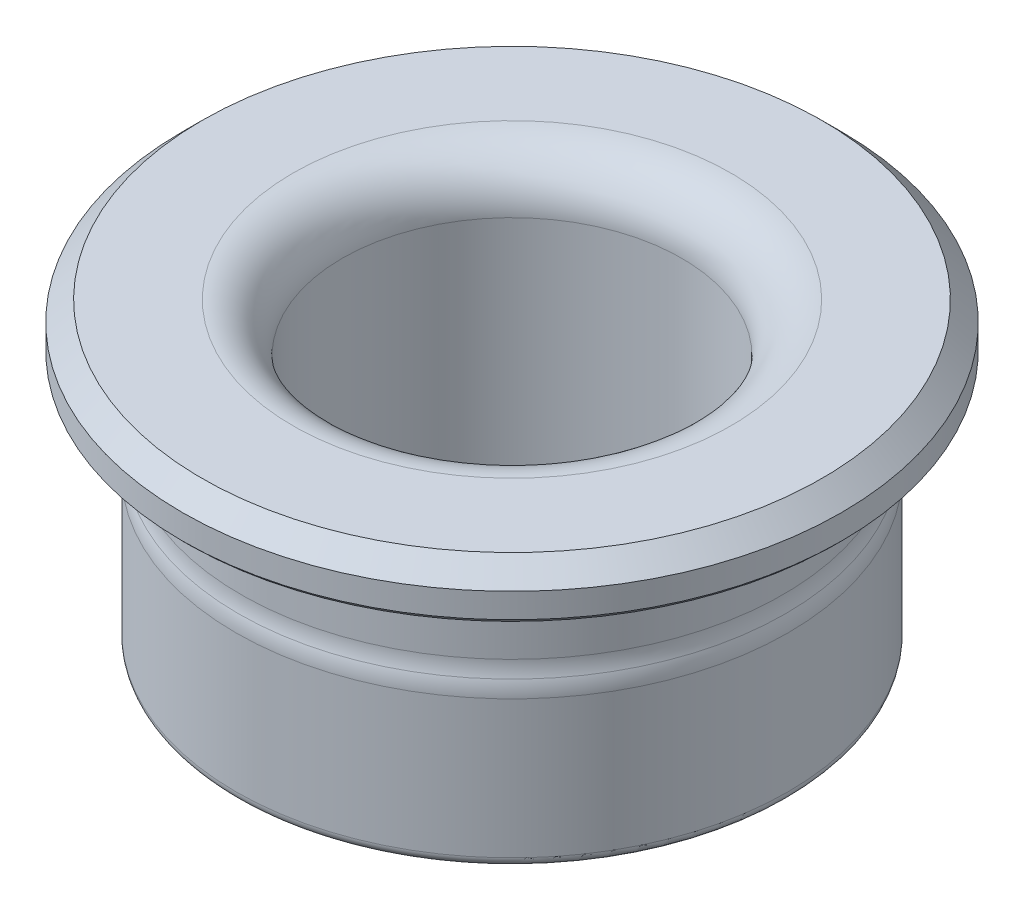
ISO-10303-21;
HEADER;
FILE_DESCRIPTION(('STEP AP214'),'2;1');
FILE_NAME('part.step','',(''),(''),'','','');
FILE_SCHEMA(('AUTOMOTIVE_DESIGN { 1 0 10303 214 1 1 1 1 }'));
ENDSEC;
DATA;
#1=APPLICATION_CONTEXT('core data for automotive mechanical design processes');
#2=APPLICATION_PROTOCOL_DEFINITION('international standard','automotive_design',2000,#1);
#3=PRODUCT_CONTEXT('',#1,'mechanical');
#4=PRODUCT('Part','Part','',(#3));
#5=PRODUCT_RELATED_PRODUCT_CATEGORY('part','',(#4));
#6=PRODUCT_DEFINITION_FORMATION('','',#4);
#7=PRODUCT_DEFINITION_CONTEXT('part definition',#1,'design');
#8=PRODUCT_DEFINITION('design','',#6,#7);
#9=PRODUCT_DEFINITION_SHAPE('','',#8);
#10=(LENGTH_UNIT() NAMED_UNIT(*) SI_UNIT(.MILLI.,.METRE.));
#11=(NAMED_UNIT(*) PLANE_ANGLE_UNIT() SI_UNIT($,.RADIAN.));
#12=(NAMED_UNIT(*) SI_UNIT($,.STERADIAN.) SOLID_ANGLE_UNIT());
#13=UNCERTAINTY_MEASURE_WITH_UNIT(LENGTH_MEASURE(1.E-05),#10,'distance_accuracy_value','');
#14=(GEOMETRIC_REPRESENTATION_CONTEXT(3) GLOBAL_UNCERTAINTY_ASSIGNED_CONTEXT((#13)) GLOBAL_UNIT_ASSIGNED_CONTEXT((#10,
#11,#12)) REPRESENTATION_CONTEXT('',''));
#15=CARTESIAN_POINT('',(0.,0.,0.));
#16=DIRECTION('',(0.,0.,1.));
#17=DIRECTION('',(1.,0.,0.));
#18=AXIS2_PLACEMENT_3D('',#15,#16,#17);
#19=CARTESIAN_POINT('',(0.,0.,0.));
#20=DIRECTION('',(0.,1.,0.));
#21=DIRECTION('',(-1.,0.,0.));
#22=AXIS2_PLACEMENT_3D('',#19,#20,#21);
#23=PLANE('',#22);
#24=CARTESIAN_POINT('',(0.,0.,0.));
#25=DIRECTION('',(0.,1.,0.));
#26=DIRECTION('',(-1.,0.,0.));
#27=AXIS2_PLACEMENT_3D('',#24,#25,#26);
#28=CIRCLE('',#27,5.41);
#29=CARTESIAN_POINT('',(-5.41,0.,0.));
#30=VERTEX_POINT('',#29);
#31=EDGE_CURVE('E116',#30,#30,#28,.T.);
#32=ORIENTED_EDGE('',*,*,#31,.F.);
#33=EDGE_LOOP('',(#32));
#34=FACE_BOUND('',#33,.T.);
#35=CARTESIAN_POINT('',(0.,0.,0.));
#36=DIRECTION('',(0.,1.,0.));
#37=DIRECTION('',(-1.,0.,0.));
#38=AXIS2_PLACEMENT_3D('',#35,#36,#37);
#39=CIRCLE('',#38,3.65);
#40=CARTESIAN_POINT('',(-3.65,0.,0.));
#41=VERTEX_POINT('',#40);
#42=EDGE_CURVE('E10',#41,#41,#39,.T.);
#43=ORIENTED_EDGE('',*,*,#42,.T.);
#44=EDGE_LOOP('',(#43));
#45=FACE_BOUND('',#44,.T.);
#46=ADVANCED_FACE('F51',(#34,#45),#23,.F.);
#47=CARTESIAN_POINT('',(0.,0.2,0.));
#48=DIRECTION('',(0.,1.,0.));
#49=DIRECTION('',(-1.,0.,0.));
#50=AXIS2_PLACEMENT_3D('',#47,#48,#49);
#51=TOROIDAL_SURFACE('',#50,3.65,0.2);
#52=CARTESIAN_POINT('',(0.,0.200000000000001,0.));
#53=DIRECTION('',(0.,1.,0.));
#54=DIRECTION('',(-1.,0.,0.));
#55=AXIS2_PLACEMENT_3D('',#52,#53,#54);
#56=CIRCLE('',#55,3.45);
#57=CARTESIAN_POINT('',(-3.45,0.2,0.));
#58=VERTEX_POINT('',#57);
#59=EDGE_CURVE('E58',#58,#58,#56,.T.);
#60=ORIENTED_EDGE('',*,*,#59,.T.);
#61=EDGE_LOOP('',(#60));
#62=FACE_BOUND('',#61,.T.);
#63=ORIENTED_EDGE('',*,*,#42,.F.);
#64=EDGE_LOOP('',(#63));
#65=FACE_BOUND('',#64,.T.);
#66=ADVANCED_FACE('F125',(#62,#65),#51,.T.);
#67=CARTESIAN_POINT('',(0.,11.984375,0.));
#68=DIRECTION('',(0.,1.,0.));
#69=DIRECTION('',(-1.,0.,0.));
#70=AXIS2_PLACEMENT_3D('',#67,#68,#69);
#71=CYLINDRICAL_SURFACE('',#70,3.45);
#72=CARTESIAN_POINT('',(0.,5.060607,0.));
#73=DIRECTION('',(0.,1.,0.));
#74=DIRECTION('',(-1.,0.,0.));
#75=AXIS2_PLACEMENT_3D('',#72,#73,#74);
#76=CIRCLE('',#75,3.45);
#77=CARTESIAN_POINT('',(-3.45,5.060607,0.));
#78=VERTEX_POINT('',#77);
#79=EDGE_CURVE('E64',#78,#78,#76,.T.);
#80=ORIENTED_EDGE('',*,*,#79,.T.);
#81=EDGE_LOOP('',(#80));
#82=FACE_BOUND('',#81,.T.);
#83=ORIENTED_EDGE('',*,*,#59,.F.);
#84=EDGE_LOOP('',(#83));
#85=FACE_BOUND('',#84,.T.);
#86=ADVANCED_FACE('F128',(#82,#85),#71,.F.);
#87=CARTESIAN_POINT('',(0.,5.060607,0.));
#88=DIRECTION('',(0.,1.,0.));
#89=DIRECTION('',(-1.,0.,0.));
#90=AXIS2_PLACEMENT_3D('',#87,#88,#89);
#91=TOROIDAL_SURFACE('',#90,4.45,1.);
#92=CARTESIAN_POINT('',(0.,6.060607,0.));
#93=DIRECTION('',(0.,1.,0.));
#94=DIRECTION('',(-1.,0.,0.));
#95=AXIS2_PLACEMENT_3D('',#92,#93,#94);
#96=CIRCLE('',#95,4.45);
#97=CARTESIAN_POINT('',(-4.45,6.060607,0.));
#98=VERTEX_POINT('',#97);
#99=EDGE_CURVE('E70',#98,#98,#96,.T.);
#100=ORIENTED_EDGE('',*,*,#99,.T.);
#101=EDGE_LOOP('',(#100));
#102=FACE_BOUND('',#101,.T.);
#103=ORIENTED_EDGE('',*,*,#79,.F.);
#104=EDGE_LOOP('',(#103));
#105=FACE_BOUND('',#104,.T.);
#106=ADVANCED_FACE('F131',(#102,#105),#91,.T.);
#107=CARTESIAN_POINT('',(0.,6.060607,0.));
#108=DIRECTION('',(0.,1.,0.));
#109=DIRECTION('',(-1.,0.,0.));
#110=AXIS2_PLACEMENT_3D('',#107,#108,#109);
#111=PLANE('',#110);
#112=CARTESIAN_POINT('',(0.,6.060607,0.));
#113=DIRECTION('',(0.,1.,0.));
#114=DIRECTION('',(-1.,0.,0.));
#115=AXIS2_PLACEMENT_3D('',#112,#113,#114);
#116=CIRCLE('',#115,6.3);
#117=CARTESIAN_POINT('',(-6.3,6.060607,0.));
#118=VERTEX_POINT('',#117);
#119=EDGE_CURVE('E76',#118,#118,#116,.T.);
#120=ORIENTED_EDGE('',*,*,#119,.T.);
#121=EDGE_LOOP('',(#120));
#122=FACE_BOUND('',#121,.T.);
#123=ORIENTED_EDGE('',*,*,#99,.F.);
#124=EDGE_LOOP('',(#123));
#125=FACE_BOUND('',#124,.T.);
#126=ADVANCED_FACE('F138',(#122,#125),#111,.T.);
#127=CARTESIAN_POINT('',(0.,5.660607,0.));
#128=DIRECTION('',(0.,-1.,0.));
#129=DIRECTION('',(1.,0.,0.));
#130=AXIS2_PLACEMENT_3D('',#127,#128,#129);
#131=CONICAL_SURFACE('',#130,6.7,0.785398163397443);
#132=ORIENTED_EDGE('',*,*,#119,.F.);
#133=EDGE_LOOP('',(#132));
#134=FACE_BOUND('',#133,.T.);
#135=CARTESIAN_POINT('',(0.,5.660607,0.));
#136=DIRECTION('',(0.,1.,0.));
#137=DIRECTION('',(-1.,0.,0.));
#138=AXIS2_PLACEMENT_3D('',#135,#136,#137);
#139=CIRCLE('',#138,6.7);
#140=CARTESIAN_POINT('',(-6.7,5.660607,0.));
#141=VERTEX_POINT('',#140);
#142=EDGE_CURVE('E80',#141,#141,#139,.T.);
#143=ORIENTED_EDGE('',*,*,#142,.T.);
#144=EDGE_LOOP('',(#143));
#145=FACE_BOUND('',#144,.T.);
#146=ADVANCED_FACE('F142',(#134,#145),#131,.T.);
#147=CARTESIAN_POINT('',(0.,11.984375,0.));
#148=DIRECTION('',(0.,1.,0.));
#149=DIRECTION('',(-1.,0.,0.));
#150=AXIS2_PLACEMENT_3D('',#147,#148,#149);
#151=CYLINDRICAL_SURFACE('',#150,6.7);
#152=CARTESIAN_POINT('',(0.,5.160607,0.));
#153=DIRECTION('',(0.,1.,0.));
#154=DIRECTION('',(-1.,0.,0.));
#155=AXIS2_PLACEMENT_3D('',#152,#153,#154);
#156=CIRCLE('',#155,6.7);
#157=CARTESIAN_POINT('',(-6.7,5.160607,0.));
#158=VERTEX_POINT('',#157);
#159=EDGE_CURVE('E84',#158,#158,#156,.T.);
#160=ORIENTED_EDGE('',*,*,#159,.T.);
#161=EDGE_LOOP('',(#160));
#162=FACE_BOUND('',#161,.T.);
#163=ORIENTED_EDGE('',*,*,#142,.F.);
#164=EDGE_LOOP('',(#163));
#165=FACE_BOUND('',#164,.T.);
#166=ADVANCED_FACE('F146',(#162,#165),#151,.T.);
#167=CARTESIAN_POINT('',(0.,5.060607,0.));
#168=DIRECTION('',(0.,1.,0.));
#169=DIRECTION('',(-1.,0.,0.));
#170=AXIS2_PLACEMENT_3D('',#167,#168,#169);
#171=CONICAL_SURFACE('',#170,6.6,0.785398163397448);
#172=ORIENTED_EDGE('',*,*,#159,.F.);
#173=EDGE_LOOP('',(#172));
#174=FACE_BOUND('',#173,.T.);
#175=CARTESIAN_POINT('',(0.,5.060607,0.));
#176=DIRECTION('',(0.,1.,0.));
#177=DIRECTION('',(-1.,0.,0.));
#178=AXIS2_PLACEMENT_3D('',#175,#176,#177);
#179=CIRCLE('',#178,6.6);
#180=CARTESIAN_POINT('',(-6.6,5.060607,0.));
#181=VERTEX_POINT('',#180);
#182=EDGE_CURVE('E88',#181,#181,#179,.T.);
#183=ORIENTED_EDGE('',*,*,#182,.T.);
#184=EDGE_LOOP('',(#183));
#185=FACE_BOUND('',#184,.T.);
#186=ADVANCED_FACE('F150',(#174,#185),#171,.T.);
#187=CARTESIAN_POINT('',(0.,5.060607,0.));
#188=DIRECTION('',(0.,-1.,0.));
#189=DIRECTION('',(1.,0.,0.));
#190=AXIS2_PLACEMENT_3D('',#187,#188,#189);
#191=PLANE('',#190);
#192=CARTESIAN_POINT('',(0.,5.060607,0.));
#193=DIRECTION('',(0.,1.,0.));
#194=DIRECTION('',(-1.,0.,0.));
#195=AXIS2_PLACEMENT_3D('',#192,#193,#194);
#196=CIRCLE('',#195,5.81);
#197=CARTESIAN_POINT('',(-5.81,5.060607,0.));
#198=VERTEX_POINT('',#197);
#199=EDGE_CURVE('E92',#198,#198,#196,.T.);
#200=ORIENTED_EDGE('',*,*,#199,.T.);
#201=EDGE_LOOP('',(#200));
#202=FACE_BOUND('',#201,.T.);
#203=ORIENTED_EDGE('',*,*,#182,.F.);
#204=EDGE_LOOP('',(#203));
#205=FACE_BOUND('',#204,.T.);
#206=ADVANCED_FACE('F154',(#202,#205),#191,.T.);
#207=CARTESIAN_POINT('',(0.,4.760607,0.));
#208=DIRECTION('',(0.,1.,0.));
#209=DIRECTION('',(-1.,0.,0.));
#210=AXIS2_PLACEMENT_3D('',#207,#208,#209);
#211=TOROIDAL_SURFACE('',#210,5.81,0.3);
#212=ORIENTED_EDGE('',*,*,#199,.F.);
#213=EDGE_LOOP('',(#212));
#214=FACE_BOUND('',#213,.T.);
#215=CARTESIAN_POINT('',(0.,4.760607,0.));
#216=DIRECTION('',(0.,1.,0.));
#217=DIRECTION('',(-1.,0.,0.));
#218=AXIS2_PLACEMENT_3D('',#215,#216,#217);
#219=CIRCLE('',#218,5.51);
#220=CARTESIAN_POINT('',(-5.51,4.760607,0.));
#221=VERTEX_POINT('',#220);
#222=EDGE_CURVE('E96',#221,#221,#219,.T.);
#223=ORIENTED_EDGE('',*,*,#222,.T.);
#224=EDGE_LOOP('',(#223));
#225=FACE_BOUND('',#224,.T.);
#226=ADVANCED_FACE('F158',(#214,#225),#211,.F.);
#227=CARTESIAN_POINT('',(0.,11.984375,0.));
#228=DIRECTION('',(0.,1.,0.));
#229=DIRECTION('',(-1.,0.,0.));
#230=AXIS2_PLACEMENT_3D('',#227,#228,#229);
#231=CYLINDRICAL_SURFACE('',#230,5.51);
#232=CARTESIAN_POINT('',(0.,3.62149979983984,0.));
#233=DIRECTION('',(0.,1.,0.));
#234=DIRECTION('',(-1.,0.,0.));
#235=AXIS2_PLACEMENT_3D('',#232,#233,#234);
#236=CIRCLE('',#235,5.51);
#237=CARTESIAN_POINT('',(-5.51,3.62149979983984,0.));
#238=VERTEX_POINT('',#237);
#239=EDGE_CURVE('E100',#238,#238,#236,.T.);
#240=ORIENTED_EDGE('',*,*,#239,.T.);
#241=EDGE_LOOP('',(#240));
#242=FACE_BOUND('',#241,.T.);
#243=ORIENTED_EDGE('',*,*,#222,.F.);
#244=EDGE_LOOP('',(#243));
#245=FACE_BOUND('',#244,.T.);
#246=ADVANCED_FACE('F162',(#242,#245),#231,.T.);
#247=CARTESIAN_POINT('',(0.,3.62149979983984,0.));
#248=DIRECTION('',(0.,1.,0.));
#249=DIRECTION('',(-1.,0.,0.));
#250=AXIS2_PLACEMENT_3D('',#247,#248,#249);
#251=TOROIDAL_SURFACE('',#250,6.51,1.);
#252=CARTESIAN_POINT('',(0.,3.30924989991992,0.));
#253=DIRECTION('',(0.,1.,0.));
#254=DIRECTION('',(-1.,0.,0.));
#255=AXIS2_PLACEMENT_3D('',#252,#253,#254);
#256=CIRCLE('',#255,5.56);
#257=CARTESIAN_POINT('',(-5.56,3.30924989991992,0.));
#258=VERTEX_POINT('',#257);
#259=EDGE_CURVE('E104',#258,#258,#256,.T.);
#260=ORIENTED_EDGE('',*,*,#259,.T.);
#261=EDGE_LOOP('',(#260));
#262=FACE_BOUND('',#261,.T.);
#263=ORIENTED_EDGE('',*,*,#239,.F.);
#264=EDGE_LOOP('',(#263));
#265=FACE_BOUND('',#264,.T.);
#266=ADVANCED_FACE('F166',(#262,#265),#251,.F.);
#267=CARTESIAN_POINT('',(0.,2.997,0.));
#268=DIRECTION('',(0.,1.,0.));
#269=DIRECTION('',(-1.,0.,0.));
#270=AXIS2_PLACEMENT_3D('',#267,#268,#269);
#271=TOROIDAL_SURFACE('',#270,4.61,1.);
#272=CARTESIAN_POINT('',(0.,2.997,0.));
#273=DIRECTION('',(0.,1.,0.));
#274=DIRECTION('',(-1.,0.,0.));
#275=AXIS2_PLACEMENT_3D('',#272,#273,#274);
#276=CIRCLE('',#275,5.61);
#277=CARTESIAN_POINT('',(-5.61,2.997,0.));
#278=VERTEX_POINT('',#277);
#279=EDGE_CURVE('E108',#278,#278,#276,.T.);
#280=ORIENTED_EDGE('',*,*,#279,.T.);
#281=EDGE_LOOP('',(#280));
#282=FACE_BOUND('',#281,.T.);
#283=ORIENTED_EDGE('',*,*,#259,.F.);
#284=EDGE_LOOP('',(#283));
#285=FACE_BOUND('',#284,.T.);
#286=ADVANCED_FACE('F170',(#282,#285),#271,.T.);
#287=CARTESIAN_POINT('',(0.,11.984375,0.));
#288=DIRECTION('',(0.,1.,0.));
#289=DIRECTION('',(-1.,0.,0.));
#290=AXIS2_PLACEMENT_3D('',#287,#288,#289);
#291=CYLINDRICAL_SURFACE('',#290,5.61);
#292=ORIENTED_EDGE('',*,*,#279,.F.);
#293=EDGE_LOOP('',(#292));
#294=FACE_BOUND('',#293,.T.);
#295=CARTESIAN_POINT('',(0.,0.200000000000002,0.));
#296=DIRECTION('',(0.,1.,0.));
#297=DIRECTION('',(-1.,0.,0.));
#298=AXIS2_PLACEMENT_3D('',#295,#296,#297);
#299=CIRCLE('',#298,5.61);
#300=CARTESIAN_POINT('',(-5.61,0.200000000000001,0.));
#301=VERTEX_POINT('',#300);
#302=EDGE_CURVE('E112',#301,#301,#299,.T.);
#303=ORIENTED_EDGE('',*,*,#302,.T.);
#304=EDGE_LOOP('',(#303));
#305=FACE_BOUND('',#304,.T.);
#306=ADVANCED_FACE('F174',(#294,#305),#291,.T.);
#307=CARTESIAN_POINT('',(0.,0.200000000000002,0.));
#308=DIRECTION('',(0.,1.,0.));
#309=DIRECTION('',(-1.,0.,0.));
#310=AXIS2_PLACEMENT_3D('',#307,#308,#309);
#311=TOROIDAL_SURFACE('',#310,5.41,0.2);
#312=ORIENTED_EDGE('',*,*,#302,.F.);
#313=EDGE_LOOP('',(#312));
#314=FACE_BOUND('',#313,.T.);
#315=ORIENTED_EDGE('',*,*,#31,.T.);
#316=EDGE_LOOP('',(#315));
#317=FACE_BOUND('',#316,.T.);
#318=ADVANCED_FACE('F122',(#314,#317),#311,.T.);
#319=CLOSED_SHELL('',(#46,#66,#86,#106,#126,#146,#166,#186,#206,#226,#246,#266,#286,#306,#318));
#320=MANIFOLD_SOLID_BREP('B2',#319);
#321=ADVANCED_BREP_SHAPE_REPRESENTATION('',(#18,#320),#14);
#322=SHAPE_DEFINITION_REPRESENTATION(#9,#321);
ENDSEC;
END-ISO-10303-21;
